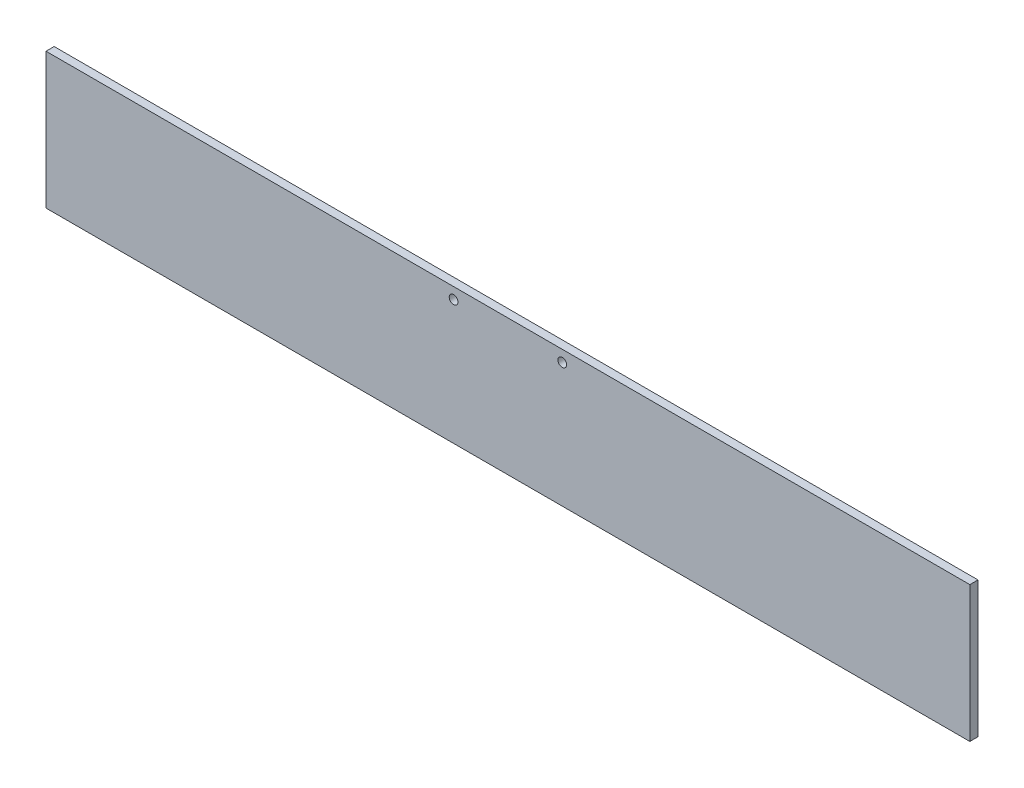
ISO-10303-21;
HEADER;
FILE_DESCRIPTION(('STEP AP214'),'2;1');
FILE_NAME('part.step','',(''),(''),'','','');
FILE_SCHEMA(('AUTOMOTIVE_DESIGN { 1 0 10303 214 1 1 1 1 }'));
ENDSEC;
DATA;
#1=APPLICATION_CONTEXT('core data for automotive mechanical design processes');
#2=APPLICATION_PROTOCOL_DEFINITION('international standard','automotive_design',2000,#1);
#3=PRODUCT_CONTEXT('',#1,'mechanical');
#4=PRODUCT('Part','Part','',(#3));
#5=PRODUCT_RELATED_PRODUCT_CATEGORY('part','',(#4));
#6=PRODUCT_DEFINITION_FORMATION('','',#4);
#7=PRODUCT_DEFINITION_CONTEXT('part definition',#1,'design');
#8=PRODUCT_DEFINITION('design','',#6,#7);
#9=PRODUCT_DEFINITION_SHAPE('','',#8);
#10=(LENGTH_UNIT() NAMED_UNIT(*) SI_UNIT(.MILLI.,.METRE.));
#11=(NAMED_UNIT(*) PLANE_ANGLE_UNIT() SI_UNIT($,.RADIAN.));
#12=(NAMED_UNIT(*) SI_UNIT($,.STERADIAN.) SOLID_ANGLE_UNIT());
#13=UNCERTAINTY_MEASURE_WITH_UNIT(LENGTH_MEASURE(1.E-05),#10,'distance_accuracy_value','');
#14=(GEOMETRIC_REPRESENTATION_CONTEXT(3) GLOBAL_UNCERTAINTY_ASSIGNED_CONTEXT((#13)) GLOBAL_UNIT_ASSIGNED_CONTEXT((#10,
#11,#12)) REPRESENTATION_CONTEXT('',''));
#15=CARTESIAN_POINT('',(0.,0.,0.));
#16=DIRECTION('',(0.,0.,1.));
#17=DIRECTION('',(1.,0.,0.));
#18=AXIS2_PLACEMENT_3D('',#15,#16,#17);
#19=CARTESIAN_POINT('',(0.,0.,3.));
#20=DIRECTION('',(1.,0.,0.));
#21=DIRECTION('',(0.,0.,-1.));
#22=AXIS2_PLACEMENT_3D('',#19,#20,#21);
#23=PLANE('',#22);
#24=DIRECTION('',(0.,-1.,0.));
#25=VECTOR('',#24,1.);
#26=CARTESIAN_POINT('',(0.,0.,0.));
#27=LINE('',#26,#25);
#28=CARTESIAN_POINT('',(0.,50.,0.));
#29=VERTEX_POINT('',#28);
#30=CARTESIAN_POINT('',(0.,0.,0.));
#31=VERTEX_POINT('',#30);
#32=EDGE_CURVE('E100',#29,#31,#27,.T.);
#33=ORIENTED_EDGE('',*,*,#32,.T.);
#34=DIRECTION('',(0.,0.,-1.));
#35=VECTOR('',#34,1.);
#36=CARTESIAN_POINT('',(0.,0.,3.));
#37=LINE('',#36,#35);
#38=CARTESIAN_POINT('',(0.,0.,3.));
#39=VERTEX_POINT('',#38);
#40=EDGE_CURVE('E11',#39,#31,#37,.T.);
#41=ORIENTED_EDGE('',*,*,#40,.F.);
#42=DIRECTION('',(0.,-1.,0.));
#43=VECTOR('',#42,1.);
#44=CARTESIAN_POINT('',(0.,0.,3.));
#45=LINE('',#44,#43);
#46=CARTESIAN_POINT('',(0.,50.,3.));
#47=VERTEX_POINT('',#46);
#48=EDGE_CURVE('E88',#47,#39,#45,.T.);
#49=ORIENTED_EDGE('',*,*,#48,.F.);
#50=DIRECTION('',(0.,0.,-1.));
#51=VECTOR('',#50,1.);
#52=CARTESIAN_POINT('',(0.,50.,3.));
#53=LINE('',#52,#51);
#54=EDGE_CURVE('E96',#47,#29,#53,.T.);
#55=ORIENTED_EDGE('',*,*,#54,.T.);
#56=EDGE_LOOP('',(#33,#41,#49,#55));
#57=FACE_BOUND('',#56,.T.);
#58=ADVANCED_FACE('F37',(#57),#23,.F.);
#59=CARTESIAN_POINT('',(0.,0.,3.));
#60=DIRECTION('',(0.,1.,0.));
#61=DIRECTION('',(0.,0.,1.));
#62=AXIS2_PLACEMENT_3D('',#59,#60,#61);
#63=PLANE('',#62);
#64=DIRECTION('',(1.,0.,0.));
#65=VECTOR('',#64,1.);
#66=CARTESIAN_POINT('',(0.,0.,0.));
#67=LINE('',#66,#65);
#68=CARTESIAN_POINT('',(340.,0.,0.));
#69=VERTEX_POINT('',#68);
#70=EDGE_CURVE('E92',#31,#69,#67,.T.);
#71=ORIENTED_EDGE('',*,*,#70,.T.);
#72=DIRECTION('',(0.,0.,-1.));
#73=VECTOR('',#72,1.);
#74=CARTESIAN_POINT('',(340.,0.,3.));
#75=LINE('',#74,#73);
#76=CARTESIAN_POINT('',(340.,0.,3.));
#77=VERTEX_POINT('',#76);
#78=EDGE_CURVE('E45',#77,#69,#75,.T.);
#79=ORIENTED_EDGE('',*,*,#78,.F.);
#80=DIRECTION('',(1.,0.,0.));
#81=VECTOR('',#80,1.);
#82=CARTESIAN_POINT('',(0.,0.,3.));
#83=LINE('',#82,#81);
#84=EDGE_CURVE('E83',#39,#77,#83,.T.);
#85=ORIENTED_EDGE('',*,*,#84,.F.);
#86=ORIENTED_EDGE('',*,*,#40,.T.);
#87=EDGE_LOOP('',(#71,#79,#85,#86));
#88=FACE_BOUND('',#87,.T.);
#89=ADVANCED_FACE('F91',(#88),#63,.F.);
#90=CARTESIAN_POINT('',(340.,0.,3.));
#91=DIRECTION('',(-1.,0.,0.));
#92=DIRECTION('',(0.,0.,1.));
#93=AXIS2_PLACEMENT_3D('',#90,#91,#92);
#94=PLANE('',#93);
#95=DIRECTION('',(0.,1.,0.));
#96=VECTOR('',#95,1.);
#97=CARTESIAN_POINT('',(340.,0.,0.));
#98=LINE('',#97,#96);
#99=CARTESIAN_POINT('',(340.,50.,0.));
#100=VERTEX_POINT('',#99);
#101=EDGE_CURVE('E70',#69,#100,#98,.T.);
#102=ORIENTED_EDGE('',*,*,#101,.T.);
#103=DIRECTION('',(0.,0.,-1.));
#104=VECTOR('',#103,1.);
#105=CARTESIAN_POINT('',(340.,50.,3.));
#106=LINE('',#105,#104);
#107=CARTESIAN_POINT('',(340.,50.,3.));
#108=VERTEX_POINT('',#107);
#109=EDGE_CURVE('E93',#108,#100,#106,.T.);
#110=ORIENTED_EDGE('',*,*,#109,.F.);
#111=DIRECTION('',(0.,1.,0.));
#112=VECTOR('',#111,1.);
#113=CARTESIAN_POINT('',(340.,0.,3.));
#114=LINE('',#113,#112);
#115=EDGE_CURVE('E86',#77,#108,#114,.T.);
#116=ORIENTED_EDGE('',*,*,#115,.F.);
#117=ORIENTED_EDGE('',*,*,#78,.T.);
#118=EDGE_LOOP('',(#102,#110,#116,#117));
#119=FACE_BOUND('',#118,.T.);
#120=ADVANCED_FACE('F94',(#119),#94,.F.);
#121=CARTESIAN_POINT('',(0.,50.,3.));
#122=DIRECTION('',(0.,-1.,0.));
#123=DIRECTION('',(0.,0.,-1.));
#124=AXIS2_PLACEMENT_3D('',#121,#122,#123);
#125=PLANE('',#124);
#126=DIRECTION('',(-1.,0.,0.));
#127=VECTOR('',#126,1.);
#128=CARTESIAN_POINT('',(0.,50.,0.));
#129=LINE('',#128,#127);
#130=EDGE_CURVE('E76',#100,#29,#129,.T.);
#131=ORIENTED_EDGE('',*,*,#130,.T.);
#132=ORIENTED_EDGE('',*,*,#54,.F.);
#133=DIRECTION('',(-1.,0.,0.));
#134=VECTOR('',#133,1.);
#135=CARTESIAN_POINT('',(0.,50.,3.));
#136=LINE('',#135,#134);
#137=EDGE_CURVE('E53',#108,#47,#136,.T.);
#138=ORIENTED_EDGE('',*,*,#137,.F.);
#139=ORIENTED_EDGE('',*,*,#109,.T.);
#140=EDGE_LOOP('',(#131,#132,#138,#139));
#141=FACE_BOUND('',#140,.T.);
#142=ADVANCED_FACE('F108',(#141),#125,.F.);
#143=CARTESIAN_POINT('',(0.,0.,3.));
#144=DIRECTION('',(0.,0.,-1.));
#145=DIRECTION('',(-1.,0.,0.));
#146=AXIS2_PLACEMENT_3D('',#143,#144,#145);
#147=PLANE('',#146);
#148=CARTESIAN_POINT('',(150.000000000003,45.8269985897588,3.));
#149=DIRECTION('',(0.,0.,1.));
#150=DIRECTION('',(1.,0.,0.));
#151=AXIS2_PLACEMENT_3D('',#148,#149,#150);
#152=CIRCLE('',#151,1.59999999999999);
#153=CARTESIAN_POINT('',(151.600000000003,45.8269985897588,3.));
#154=VERTEX_POINT('',#153);
#155=EDGE_CURVE('E103',#154,#154,#152,.T.);
#156=ORIENTED_EDGE('',*,*,#155,.F.);
#157=EDGE_LOOP('',(#156));
#158=FACE_BOUND('',#157,.T.);
#159=CARTESIAN_POINT('',(190.000000000003,45.8269985897589,3.));
#160=DIRECTION('',(0.,0.,1.));
#161=DIRECTION('',(1.,0.,0.));
#162=AXIS2_PLACEMENT_3D('',#159,#160,#161);
#163=CIRCLE('',#162,1.59999999999999);
#164=CARTESIAN_POINT('',(191.600000000003,45.8269985897589,3.));
#165=VERTEX_POINT('',#164);
#166=EDGE_CURVE('E114',#165,#165,#163,.T.);
#167=ORIENTED_EDGE('',*,*,#166,.F.);
#168=EDGE_LOOP('',(#167));
#169=FACE_BOUND('',#168,.T.);
#170=ORIENTED_EDGE('',*,*,#48,.T.);
#171=ORIENTED_EDGE('',*,*,#84,.T.);
#172=ORIENTED_EDGE('',*,*,#115,.T.);
#173=ORIENTED_EDGE('',*,*,#137,.T.);
#174=EDGE_LOOP('',(#170,#171,#172,#173));
#175=FACE_BOUND('',#174,.T.);
#176=ADVANCED_FACE('F84',(#158,#169,#175),#147,.F.);
#177=CARTESIAN_POINT('',(0.,0.,0.));
#178=DIRECTION('',(0.,0.,-1.));
#179=DIRECTION('',(-1.,0.,0.));
#180=AXIS2_PLACEMENT_3D('',#177,#178,#179);
#181=PLANE('',#180);
#182=CARTESIAN_POINT('',(150.000000000003,45.8269985897588,0.));
#183=DIRECTION('',(0.,0.,-1.));
#184=DIRECTION('',(-1.,0.,0.));
#185=AXIS2_PLACEMENT_3D('',#182,#183,#184);
#186=CIRCLE('',#185,1.59999999999999);
#187=CARTESIAN_POINT('',(151.600000000003,45.8269985897588,0.));
#188=VERTEX_POINT('',#187);
#189=EDGE_CURVE('E120',#188,#188,#186,.F.);
#190=ORIENTED_EDGE('',*,*,#189,.T.);
#191=EDGE_LOOP('',(#190));
#192=FACE_BOUND('',#191,.T.);
#193=CARTESIAN_POINT('',(190.000000000003,45.8269985897589,0.));
#194=DIRECTION('',(0.,0.,-1.));
#195=DIRECTION('',(-1.,0.,0.));
#196=AXIS2_PLACEMENT_3D('',#193,#194,#195);
#197=CIRCLE('',#196,1.59999999999999);
#198=CARTESIAN_POINT('',(191.600000000003,45.8269985897589,0.));
#199=VERTEX_POINT('',#198);
#200=EDGE_CURVE('E117',#199,#199,#197,.F.);
#201=ORIENTED_EDGE('',*,*,#200,.T.);
#202=EDGE_LOOP('',(#201));
#203=FACE_BOUND('',#202,.T.);
#204=ORIENTED_EDGE('',*,*,#32,.F.);
#205=ORIENTED_EDGE('',*,*,#130,.F.);
#206=ORIENTED_EDGE('',*,*,#101,.F.);
#207=ORIENTED_EDGE('',*,*,#70,.F.);
#208=EDGE_LOOP('',(#204,#205,#206,#207));
#209=FACE_BOUND('',#208,.T.);
#210=ADVANCED_FACE('F111',(#192,#203,#209),#181,.T.);
#211=CARTESIAN_POINT('',(190.000000000003,45.8269985897589,-0.00100000000000013));
#212=DIRECTION('',(0.,0.,1.));
#213=DIRECTION('',(1.,0.,0.));
#214=AXIS2_PLACEMENT_3D('',#211,#212,#213);
#215=CYLINDRICAL_SURFACE('',#214,1.59999999999999);
#216=CARTESIAN_POINT('',(191.600000000003,45.8269985897589,0.));
#217=CARTESIAN_POINT('',(191.600000000003,45.8269985897589,0.03125));
#218=CARTESIAN_POINT('',(191.600000000003,45.8269985897589,0.0625));
#219=CARTESIAN_POINT('',(191.600000000003,45.8269985897589,0.125));
#220=CARTESIAN_POINT('',(191.600000000003,45.8269985897589,0.15625));
#221=CARTESIAN_POINT('',(191.600000000003,45.8269985897589,0.21875));
#222=CARTESIAN_POINT('',(191.600000000003,45.8269985897589,0.25));
#223=CARTESIAN_POINT('',(191.600000000003,45.8269985897589,0.3125));
#224=CARTESIAN_POINT('',(191.600000000003,45.8269985897589,0.34375));
#225=CARTESIAN_POINT('',(191.600000000003,45.8269985897589,0.40625));
#226=CARTESIAN_POINT('',(191.600000000003,45.8269985897589,0.4375));
#227=CARTESIAN_POINT('',(191.600000000003,45.8269985897589,0.5));
#228=CARTESIAN_POINT('',(191.600000000003,45.8269985897589,0.53125));
#229=CARTESIAN_POINT('',(191.600000000003,45.8269985897589,0.59375));
#230=CARTESIAN_POINT('',(191.600000000003,45.8269985897589,0.625));
#231=CARTESIAN_POINT('',(191.600000000003,45.8269985897589,0.6875));
#232=CARTESIAN_POINT('',(191.600000000003,45.8269985897589,0.71875));
#233=CARTESIAN_POINT('',(191.600000000003,45.8269985897589,0.78125));
#234=CARTESIAN_POINT('',(191.600000000003,45.8269985897589,0.8125));
#235=CARTESIAN_POINT('',(191.600000000003,45.8269985897589,0.875));
#236=CARTESIAN_POINT('',(191.600000000003,45.8269985897589,0.90625));
#237=CARTESIAN_POINT('',(191.600000000003,45.8269985897589,0.96875));
#238=CARTESIAN_POINT('',(191.600000000003,45.8269985897589,1.));
#239=CARTESIAN_POINT('',(191.600000000003,45.8269985897589,1.0625));
#240=CARTESIAN_POINT('',(191.600000000003,45.8269985897589,1.09375));
#241=CARTESIAN_POINT('',(191.600000000003,45.8269985897589,1.15625));
#242=CARTESIAN_POINT('',(191.600000000003,45.8269985897589,1.1875));
#243=CARTESIAN_POINT('',(191.600000000003,45.8269985897589,1.25));
#244=CARTESIAN_POINT('',(191.600000000003,45.8269985897589,1.28125));
#245=CARTESIAN_POINT('',(191.600000000003,45.8269985897589,1.34375));
#246=CARTESIAN_POINT('',(191.600000000003,45.8269985897589,1.375));
#247=CARTESIAN_POINT('',(191.600000000003,45.8269985897589,1.4375));
#248=CARTESIAN_POINT('',(191.600000000003,45.8269985897589,1.46875));
#249=CARTESIAN_POINT('',(191.600000000003,45.8269985897589,1.53125));
#250=CARTESIAN_POINT('',(191.600000000003,45.8269985897589,1.5625));
#251=CARTESIAN_POINT('',(191.600000000003,45.8269985897589,1.625));
#252=CARTESIAN_POINT('',(191.600000000003,45.8269985897589,1.65625));
#253=CARTESIAN_POINT('',(191.600000000003,45.8269985897589,1.71875));
#254=CARTESIAN_POINT('',(191.600000000003,45.8269985897589,1.75));
#255=CARTESIAN_POINT('',(191.600000000003,45.8269985897589,1.8125));
#256=CARTESIAN_POINT('',(191.600000000003,45.8269985897589,1.84375));
#257=CARTESIAN_POINT('',(191.600000000003,45.8269985897589,1.90625));
#258=CARTESIAN_POINT('',(191.600000000003,45.8269985897589,1.9375));
#259=CARTESIAN_POINT('',(191.600000000003,45.8269985897589,2.));
#260=CARTESIAN_POINT('',(191.600000000003,45.8269985897589,2.03125));
#261=CARTESIAN_POINT('',(191.600000000003,45.8269985897589,2.09375));
#262=CARTESIAN_POINT('',(191.600000000003,45.8269985897589,2.125));
#263=CARTESIAN_POINT('',(191.600000000003,45.8269985897589,2.1875));
#264=CARTESIAN_POINT('',(191.600000000003,45.8269985897589,2.21875));
#265=CARTESIAN_POINT('',(191.600000000003,45.8269985897589,2.28125));
#266=CARTESIAN_POINT('',(191.600000000003,45.8269985897589,2.3125));
#267=CARTESIAN_POINT('',(191.600000000003,45.8269985897589,2.375));
#268=CARTESIAN_POINT('',(191.600000000003,45.8269985897589,2.40625));
#269=CARTESIAN_POINT('',(191.600000000003,45.8269985897589,2.46875));
#270=CARTESIAN_POINT('',(191.600000000003,45.8269985897589,2.5));
#271=CARTESIAN_POINT('',(191.600000000003,45.8269985897589,2.5625));
#272=CARTESIAN_POINT('',(191.600000000003,45.8269985897589,2.59375));
#273=CARTESIAN_POINT('',(191.600000000003,45.8269985897589,2.65625));
#274=CARTESIAN_POINT('',(191.600000000003,45.8269985897589,2.6875));
#275=CARTESIAN_POINT('',(191.600000000003,45.8269985897589,2.75));
#276=CARTESIAN_POINT('',(191.600000000003,45.8269985897589,2.78125));
#277=CARTESIAN_POINT('',(191.600000000003,45.8269985897589,2.84375));
#278=CARTESIAN_POINT('',(191.600000000003,45.8269985897589,2.875));
#279=CARTESIAN_POINT('',(191.600000000003,45.8269985897589,2.9375));
#280=CARTESIAN_POINT('',(191.600000000003,45.8269985897589,2.96875));
#281=CARTESIAN_POINT('',(191.600000000003,45.8269985897589,3.));
#282=B_SPLINE_CURVE_WITH_KNOTS('',3,(#216,#217,#218,#219,#220,#221,#222,#223,#224,#225,#226,
#227,#228,#229,#230,#231,#232,#233,#234,#235,#236,#237,#238,#239,#240,#241,#242,#243,#244,#245,
#246,#247,#248,#249,#250,#251,#252,#253,#254,#255,#256,#257,#258,#259,#260,#261,#262,#263,#264,
#265,#266,#267,#268,#269,#270,#271,#272,#273,#274,#275,#276,#277,#278,#279,#280,#281),
.UNSPECIFIED.,.F.,.F.,(4,2,2,2,2,2,2,2,2,2,2,2,2,2,2,2,2,2,2,2,2,2,2,2,2,2,2,2,2,2,2,2,4),(0.,
0.09375,0.1875,0.28125,0.375,0.46875,0.5625,0.65625,0.75,0.84375,0.9375,1.03125,1.125,1.21875,
1.3125,1.40625,1.5,1.59375,1.6875,1.78125,1.875,1.96875,2.0625,2.15625,2.25,2.34375,2.4375,
2.53125,2.625,2.71875,2.8125,2.90625,3.),.UNSPECIFIED.);
#283=EDGE_CURVE('BSEAM133',#199,#165,#282,.T.);
#284=ORIENTED_EDGE('',*,*,#200,.F.);
#285=ORIENTED_EDGE('',*,*,#166,.T.);
#286=ORIENTED_EDGE('',*,*,#283,.T.);
#287=ORIENTED_EDGE('',*,*,#283,.F.);
#288=EDGE_LOOP('',(#284,#286,#285,#287));
#289=FACE_BOUND('',#288,.T.);
#290=ADVANCED_FACE('F133',(#289),#215,.F.);
#291=CARTESIAN_POINT('',(150.000000000003,45.8269985897588,-0.00100000000000013));
#292=DIRECTION('',(0.,0.,1.));
#293=DIRECTION('',(1.,0.,0.));
#294=AXIS2_PLACEMENT_3D('',#291,#292,#293);
#295=CYLINDRICAL_SURFACE('',#294,1.59999999999999);
#296=CARTESIAN_POINT('',(151.600000000003,45.8269985897588,0.));
#297=CARTESIAN_POINT('',(151.600000000003,45.8269985897588,0.03125));
#298=CARTESIAN_POINT('',(151.600000000003,45.8269985897588,0.0625));
#299=CARTESIAN_POINT('',(151.600000000003,45.8269985897588,0.125));
#300=CARTESIAN_POINT('',(151.600000000003,45.8269985897588,0.15625));
#301=CARTESIAN_POINT('',(151.600000000003,45.8269985897588,0.21875));
#302=CARTESIAN_POINT('',(151.600000000003,45.8269985897588,0.25));
#303=CARTESIAN_POINT('',(151.600000000003,45.8269985897588,0.3125));
#304=CARTESIAN_POINT('',(151.600000000003,45.8269985897588,0.34375));
#305=CARTESIAN_POINT('',(151.600000000003,45.8269985897588,0.40625));
#306=CARTESIAN_POINT('',(151.600000000003,45.8269985897588,0.4375));
#307=CARTESIAN_POINT('',(151.600000000003,45.8269985897588,0.5));
#308=CARTESIAN_POINT('',(151.600000000003,45.8269985897588,0.53125));
#309=CARTESIAN_POINT('',(151.600000000003,45.8269985897588,0.59375));
#310=CARTESIAN_POINT('',(151.600000000003,45.8269985897588,0.625));
#311=CARTESIAN_POINT('',(151.600000000003,45.8269985897588,0.6875));
#312=CARTESIAN_POINT('',(151.600000000003,45.8269985897588,0.71875));
#313=CARTESIAN_POINT('',(151.600000000003,45.8269985897588,0.78125));
#314=CARTESIAN_POINT('',(151.600000000003,45.8269985897588,0.8125));
#315=CARTESIAN_POINT('',(151.600000000003,45.8269985897588,0.875));
#316=CARTESIAN_POINT('',(151.600000000003,45.8269985897588,0.90625));
#317=CARTESIAN_POINT('',(151.600000000003,45.8269985897588,0.96875));
#318=CARTESIAN_POINT('',(151.600000000003,45.8269985897588,1.));
#319=CARTESIAN_POINT('',(151.600000000003,45.8269985897588,1.0625));
#320=CARTESIAN_POINT('',(151.600000000003,45.8269985897588,1.09375));
#321=CARTESIAN_POINT('',(151.600000000003,45.8269985897588,1.15625));
#322=CARTESIAN_POINT('',(151.600000000003,45.8269985897588,1.1875));
#323=CARTESIAN_POINT('',(151.600000000003,45.8269985897588,1.25));
#324=CARTESIAN_POINT('',(151.600000000003,45.8269985897588,1.28125));
#325=CARTESIAN_POINT('',(151.600000000003,45.8269985897588,1.34375));
#326=CARTESIAN_POINT('',(151.600000000003,45.8269985897588,1.375));
#327=CARTESIAN_POINT('',(151.600000000003,45.8269985897588,1.4375));
#328=CARTESIAN_POINT('',(151.600000000003,45.8269985897588,1.46875));
#329=CARTESIAN_POINT('',(151.600000000003,45.8269985897588,1.53125));
#330=CARTESIAN_POINT('',(151.600000000003,45.8269985897588,1.5625));
#331=CARTESIAN_POINT('',(151.600000000003,45.8269985897588,1.625));
#332=CARTESIAN_POINT('',(151.600000000003,45.8269985897588,1.65625));
#333=CARTESIAN_POINT('',(151.600000000003,45.8269985897588,1.71875));
#334=CARTESIAN_POINT('',(151.600000000003,45.8269985897588,1.75));
#335=CARTESIAN_POINT('',(151.600000000003,45.8269985897588,1.8125));
#336=CARTESIAN_POINT('',(151.600000000003,45.8269985897588,1.84375));
#337=CARTESIAN_POINT('',(151.600000000003,45.8269985897588,1.90625));
#338=CARTESIAN_POINT('',(151.600000000003,45.8269985897588,1.9375));
#339=CARTESIAN_POINT('',(151.600000000003,45.8269985897588,2.));
#340=CARTESIAN_POINT('',(151.600000000003,45.8269985897588,2.03125));
#341=CARTESIAN_POINT('',(151.600000000003,45.8269985897588,2.09375));
#342=CARTESIAN_POINT('',(151.600000000003,45.8269985897588,2.125));
#343=CARTESIAN_POINT('',(151.600000000003,45.8269985897588,2.1875));
#344=CARTESIAN_POINT('',(151.600000000003,45.8269985897588,2.21875));
#345=CARTESIAN_POINT('',(151.600000000003,45.8269985897588,2.28125));
#346=CARTESIAN_POINT('',(151.600000000003,45.8269985897588,2.3125));
#347=CARTESIAN_POINT('',(151.600000000003,45.8269985897588,2.375));
#348=CARTESIAN_POINT('',(151.600000000003,45.8269985897588,2.40625));
#349=CARTESIAN_POINT('',(151.600000000003,45.8269985897588,2.46875));
#350=CARTESIAN_POINT('',(151.600000000003,45.8269985897588,2.5));
#351=CARTESIAN_POINT('',(151.600000000003,45.8269985897588,2.5625));
#352=CARTESIAN_POINT('',(151.600000000003,45.8269985897588,2.59375));
#353=CARTESIAN_POINT('',(151.600000000003,45.8269985897588,2.65625));
#354=CARTESIAN_POINT('',(151.600000000003,45.8269985897588,2.6875));
#355=CARTESIAN_POINT('',(151.600000000003,45.8269985897588,2.75));
#356=CARTESIAN_POINT('',(151.600000000003,45.8269985897588,2.78125));
#357=CARTESIAN_POINT('',(151.600000000003,45.8269985897588,2.84375));
#358=CARTESIAN_POINT('',(151.600000000003,45.8269985897588,2.875));
#359=CARTESIAN_POINT('',(151.600000000003,45.8269985897588,2.9375));
#360=CARTESIAN_POINT('',(151.600000000003,45.8269985897588,2.96875));
#361=CARTESIAN_POINT('',(151.600000000003,45.8269985897588,3.));
#362=B_SPLINE_CURVE_WITH_KNOTS('',3,(#296,#297,#298,#299,#300,#301,#302,#303,#304,#305,#306,
#307,#308,#309,#310,#311,#312,#313,#314,#315,#316,#317,#318,#319,#320,#321,#322,#323,#324,#325,
#326,#327,#328,#329,#330,#331,#332,#333,#334,#335,#336,#337,#338,#339,#340,#341,#342,#343,#344,
#345,#346,#347,#348,#349,#350,#351,#352,#353,#354,#355,#356,#357,#358,#359,#360,#361),
.UNSPECIFIED.,.F.,.F.,(4,2,2,2,2,2,2,2,2,2,2,2,2,2,2,2,2,2,2,2,2,2,2,2,2,2,2,2,2,2,2,2,4),(0.,
0.09375,0.1875,0.28125,0.375,0.46875,0.5625,0.65625,0.75,0.84375,0.9375,1.03125,1.125,1.21875,
1.3125,1.40625,1.5,1.59375,1.6875,1.78125,1.875,1.96875,2.0625,2.15625,2.25,2.34375,2.4375,
2.53125,2.625,2.71875,2.8125,2.90625,3.),.UNSPECIFIED.);
#363=EDGE_CURVE('BSEAM126',#188,#154,#362,.T.);
#364=ORIENTED_EDGE('',*,*,#189,.F.);
#365=ORIENTED_EDGE('',*,*,#155,.T.);
#366=ORIENTED_EDGE('',*,*,#363,.T.);
#367=ORIENTED_EDGE('',*,*,#363,.F.);
#368=EDGE_LOOP('',(#364,#366,#365,#367));
#369=FACE_BOUND('',#368,.T.);
#370=ADVANCED_FACE('F126',(#369),#295,.F.);
#371=CLOSED_SHELL('',(#58,#89,#120,#142,#176,#210,#290,#370));
#372=MANIFOLD_SOLID_BREP('B2',#371);
#373=ADVANCED_BREP_SHAPE_REPRESENTATION('',(#18,#372),#14);
#374=SHAPE_DEFINITION_REPRESENTATION(#9,#373);
ENDSEC;
END-ISO-10303-21;
